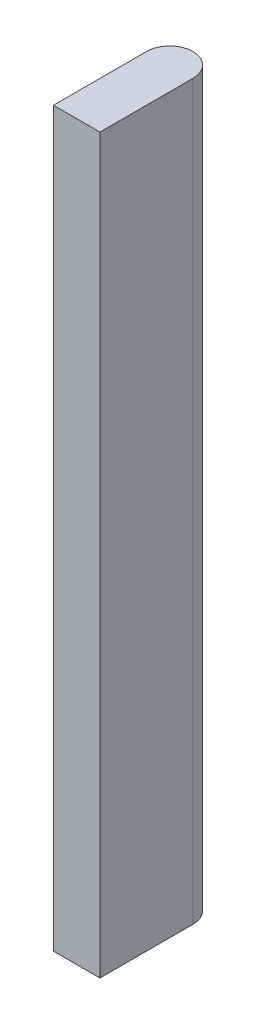
ISO-10303-21;
HEADER;
FILE_DESCRIPTION(('STEP AP214'),'2;1');
FILE_NAME('part.step','',(''),(''),'','','');
FILE_SCHEMA(('AUTOMOTIVE_DESIGN { 1 0 10303 214 1 1 1 1 }'));
ENDSEC;
DATA;
#1=APPLICATION_CONTEXT('core data for automotive mechanical design processes');
#2=APPLICATION_PROTOCOL_DEFINITION('international standard','automotive_design',2000,#1);
#3=PRODUCT_CONTEXT('',#1,'mechanical');
#4=PRODUCT('Part','Part','',(#3));
#5=PRODUCT_RELATED_PRODUCT_CATEGORY('part','',(#4));
#6=PRODUCT_DEFINITION_FORMATION('','',#4);
#7=PRODUCT_DEFINITION_CONTEXT('part definition',#1,'design');
#8=PRODUCT_DEFINITION('design','',#6,#7);
#9=PRODUCT_DEFINITION_SHAPE('','',#8);
#10=(LENGTH_UNIT() NAMED_UNIT(*) SI_UNIT(.MILLI.,.METRE.));
#11=(NAMED_UNIT(*) PLANE_ANGLE_UNIT() SI_UNIT($,.RADIAN.));
#12=(NAMED_UNIT(*) SI_UNIT($,.STERADIAN.) SOLID_ANGLE_UNIT());
#13=UNCERTAINTY_MEASURE_WITH_UNIT(LENGTH_MEASURE(1.E-05),#10,'distance_accuracy_value','');
#14=(GEOMETRIC_REPRESENTATION_CONTEXT(3) GLOBAL_UNCERTAINTY_ASSIGNED_CONTEXT((#13)) GLOBAL_UNIT_ASSIGNED_CONTEXT((#10,
#11,#12)) REPRESENTATION_CONTEXT('',''));
#15=CARTESIAN_POINT('',(0.,0.,0.));
#16=DIRECTION('',(0.,0.,1.));
#17=DIRECTION('',(1.,0.,0.));
#18=AXIS2_PLACEMENT_3D('',#15,#16,#17);
#19=CARTESIAN_POINT('',(-1.,31.5,2.5));
#20=DIRECTION('',(1.,0.,0.));
#21=DIRECTION('',(0.,0.,-1.));
#22=AXIS2_PLACEMENT_3D('',#19,#20,#21);
#23=PLANE('',#22);
#24=DIRECTION('',(0.,0.,1.));
#25=VECTOR('',#24,1.);
#26=CARTESIAN_POINT('',(-1.,0.,2.5));
#27=LINE('',#26,#25);
#28=CARTESIAN_POINT('',(-1.,0.,-1.5));
#29=VERTEX_POINT('',#28);
#30=CARTESIAN_POINT('',(-1.,0.,2.5));
#31=VERTEX_POINT('',#30);
#32=EDGE_CURVE('E113',#29,#31,#27,.T.);
#33=ORIENTED_EDGE('',*,*,#32,.T.);
#34=DIRECTION('',(0.,-1.,0.));
#35=VECTOR('',#34,1.);
#36=CARTESIAN_POINT('',(-1.,31.5,2.5));
#37=LINE('',#36,#35);
#38=CARTESIAN_POINT('',(-1.,31.5,2.5));
#39=VERTEX_POINT('',#38);
#40=EDGE_CURVE('E11',#39,#31,#37,.T.);
#41=ORIENTED_EDGE('',*,*,#40,.F.);
#42=DIRECTION('',(0.,0.,1.));
#43=VECTOR('',#42,1.);
#44=CARTESIAN_POINT('',(-1.,31.5,2.5));
#45=LINE('',#44,#43);
#46=CARTESIAN_POINT('',(-1.,31.5,-1.5));
#47=VERTEX_POINT('',#46);
#48=EDGE_CURVE('E97',#47,#39,#45,.T.);
#49=ORIENTED_EDGE('',*,*,#48,.F.);
#50=DIRECTION('',(0.,-1.,0.));
#51=VECTOR('',#50,1.);
#52=CARTESIAN_POINT('',(-1.,31.5,-1.5));
#53=LINE('',#52,#51);
#54=EDGE_CURVE('E109',#47,#29,#53,.T.);
#55=ORIENTED_EDGE('',*,*,#54,.T.);
#56=EDGE_LOOP('',(#33,#41,#49,#55));
#57=FACE_BOUND('',#56,.T.);
#58=ADVANCED_FACE('F45',(#57),#23,.F.);
#59=CARTESIAN_POINT('',(-1.,31.5,2.5));
#60=DIRECTION('',(0.,0.,-1.));
#61=DIRECTION('',(-1.,0.,0.));
#62=AXIS2_PLACEMENT_3D('',#59,#60,#61);
#63=PLANE('',#62);
#64=DIRECTION('',(1.,0.,0.));
#65=VECTOR('',#64,1.);
#66=CARTESIAN_POINT('',(-1.,0.,2.5));
#67=LINE('',#66,#65);
#68=CARTESIAN_POINT('',(1.,0.,2.5));
#69=VERTEX_POINT('',#68);
#70=EDGE_CURVE('E102',#31,#69,#67,.T.);
#71=ORIENTED_EDGE('',*,*,#70,.T.);
#72=DIRECTION('',(0.,-1.,0.));
#73=VECTOR('',#72,1.);
#74=CARTESIAN_POINT('',(1.,31.5,2.5));
#75=LINE('',#74,#73);
#76=CARTESIAN_POINT('',(1.,31.5,2.5));
#77=VERTEX_POINT('',#76);
#78=EDGE_CURVE('E54',#77,#69,#75,.T.);
#79=ORIENTED_EDGE('',*,*,#78,.F.);
#80=DIRECTION('',(1.,0.,0.));
#81=VECTOR('',#80,1.);
#82=CARTESIAN_POINT('',(-1.,31.5,2.5));
#83=LINE('',#82,#81);
#84=EDGE_CURVE('E92',#39,#77,#83,.T.);
#85=ORIENTED_EDGE('',*,*,#84,.F.);
#86=ORIENTED_EDGE('',*,*,#40,.T.);
#87=EDGE_LOOP('',(#71,#79,#85,#86));
#88=FACE_BOUND('',#87,.T.);
#89=ADVANCED_FACE('F101',(#88),#63,.F.);
#90=CARTESIAN_POINT('',(1.,31.5,2.5));
#91=DIRECTION('',(-1.,0.,0.));
#92=DIRECTION('',(0.,0.,1.));
#93=AXIS2_PLACEMENT_3D('',#90,#91,#92);
#94=PLANE('',#93);
#95=DIRECTION('',(0.,0.,-1.));
#96=VECTOR('',#95,1.);
#97=CARTESIAN_POINT('',(1.,0.,2.5));
#98=LINE('',#97,#96);
#99=CARTESIAN_POINT('',(1.,0.,-1.5));
#100=VERTEX_POINT('',#99);
#101=EDGE_CURVE('E79',#69,#100,#98,.T.);
#102=ORIENTED_EDGE('',*,*,#101,.T.);
#103=DIRECTION('',(0.,-1.,0.));
#104=VECTOR('',#103,1.);
#105=CARTESIAN_POINT('',(1.,31.5,-1.5));
#106=LINE('',#105,#104);
#107=CARTESIAN_POINT('',(1.,31.5,-1.5));
#108=VERTEX_POINT('',#107);
#109=EDGE_CURVE('E104',#108,#100,#106,.T.);
#110=ORIENTED_EDGE('',*,*,#109,.F.);
#111=DIRECTION('',(0.,0.,-1.));
#112=VECTOR('',#111,1.);
#113=CARTESIAN_POINT('',(1.,31.5,2.5));
#114=LINE('',#113,#112);
#115=EDGE_CURVE('E95',#77,#108,#114,.T.);
#116=ORIENTED_EDGE('',*,*,#115,.F.);
#117=ORIENTED_EDGE('',*,*,#78,.T.);
#118=EDGE_LOOP('',(#102,#110,#116,#117));
#119=FACE_BOUND('',#118,.T.);
#120=ADVANCED_FACE('F105',(#119),#94,.F.);
#121=CARTESIAN_POINT('',(0.,31.5,-1.5));
#122=DIRECTION('',(0.,-1.,0.));
#123=DIRECTION('',(0.,0.,-1.));
#124=AXIS2_PLACEMENT_3D('',#121,#122,#123);
#125=CYLINDRICAL_SURFACE('',#124,1.);
#126=CARTESIAN_POINT('',(0.,0.,-1.5));
#127=DIRECTION('',(0.,1.,0.));
#128=DIRECTION('',(0.,0.,1.));
#129=AXIS2_PLACEMENT_3D('',#126,#127,#128);
#130=CIRCLE('',#129,1.);
#131=EDGE_CURVE('E85',#100,#29,#130,.T.);
#132=ORIENTED_EDGE('',*,*,#131,.T.);
#133=ORIENTED_EDGE('',*,*,#54,.F.);
#134=CARTESIAN_POINT('',(0.,31.5,-1.5));
#135=DIRECTION('',(0.,1.,0.));
#136=DIRECTION('',(0.,0.,1.));
#137=AXIS2_PLACEMENT_3D('',#134,#135,#136);
#138=CIRCLE('',#137,1.);
#139=EDGE_CURVE('E62',#108,#47,#138,.T.);
#140=ORIENTED_EDGE('',*,*,#139,.F.);
#141=ORIENTED_EDGE('',*,*,#109,.T.);
#142=EDGE_LOOP('',(#132,#133,#140,#141));
#143=FACE_BOUND('',#142,.T.);
#144=ADVANCED_FACE('F126',(#143),#125,.T.);
#145=CARTESIAN_POINT('',(0.,31.5,-1.5));
#146=DIRECTION('',(0.,1.,0.));
#147=DIRECTION('',(0.,0.,1.));
#148=AXIS2_PLACEMENT_3D('',#145,#146,#147);
#149=PLANE('',#148);
#150=ORIENTED_EDGE('',*,*,#48,.T.);
#151=ORIENTED_EDGE('',*,*,#84,.T.);
#152=ORIENTED_EDGE('',*,*,#115,.T.);
#153=ORIENTED_EDGE('',*,*,#139,.T.);
#154=EDGE_LOOP('',(#150,#151,#152,#153));
#155=FACE_BOUND('',#154,.T.);
#156=ADVANCED_FACE('F93',(#155),#149,.T.);
#157=CARTESIAN_POINT('',(0.,0.,-1.5));
#158=DIRECTION('',(0.,1.,0.));
#159=DIRECTION('',(0.,0.,1.));
#160=AXIS2_PLACEMENT_3D('',#157,#158,#159);
#161=PLANE('',#160);
#162=ORIENTED_EDGE('',*,*,#32,.F.);
#163=ORIENTED_EDGE('',*,*,#131,.F.);
#164=ORIENTED_EDGE('',*,*,#101,.F.);
#165=ORIENTED_EDGE('',*,*,#70,.F.);
#166=EDGE_LOOP('',(#162,#163,#164,#165));
#167=FACE_BOUND('',#166,.T.);
#168=ADVANCED_FACE('F129',(#167),#161,.F.);
#169=CLOSED_SHELL('',(#58,#89,#120,#144,#156,#168));
#170=MANIFOLD_SOLID_BREP('B2',#169);
#171=ADVANCED_BREP_SHAPE_REPRESENTATION('',(#18,#170),#14);
#172=SHAPE_DEFINITION_REPRESENTATION(#9,#171);
ENDSEC;
END-ISO-10303-21;
